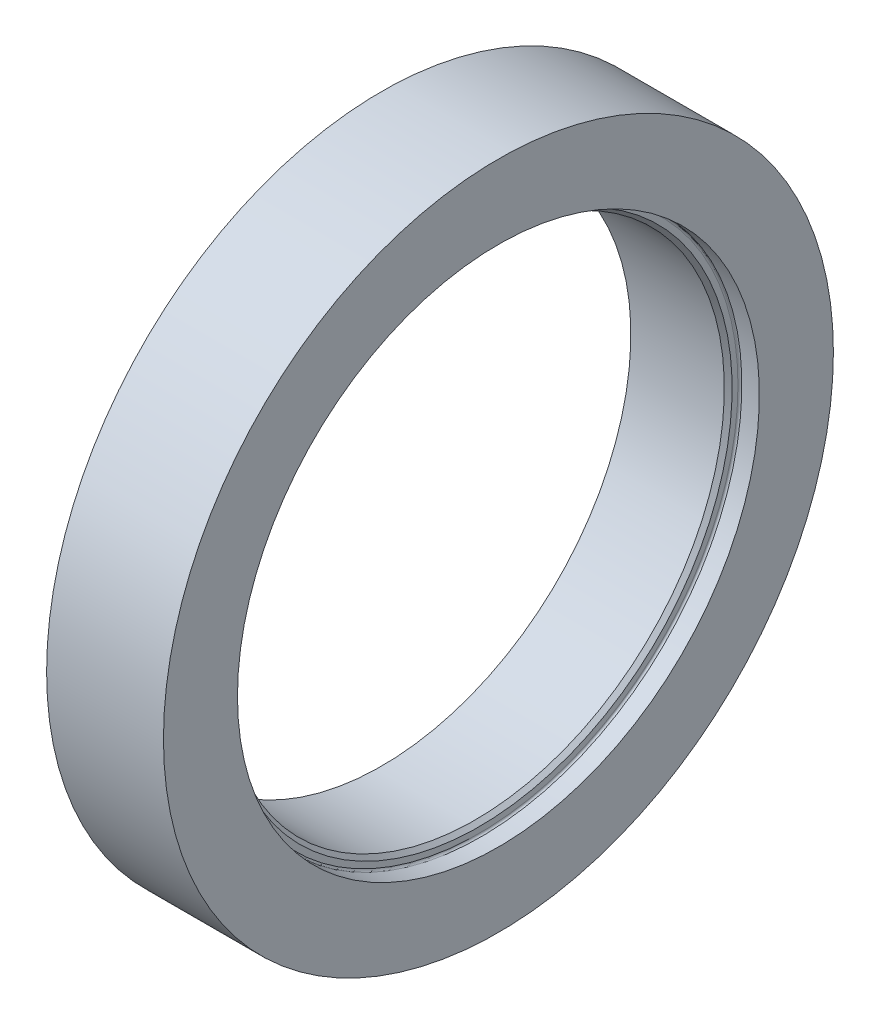
ISO-10303-21;
HEADER;
FILE_DESCRIPTION(('STEP AP214'),'2;1');
FILE_NAME('part.step','',(''),(''),'','','');
FILE_SCHEMA(('AUTOMOTIVE_DESIGN { 1 0 10303 214 1 1 1 1 }'));
ENDSEC;
DATA;
#1=APPLICATION_CONTEXT('core data for automotive mechanical design processes');
#2=APPLICATION_PROTOCOL_DEFINITION('international standard','automotive_design',2000,#1);
#3=PRODUCT_CONTEXT('',#1,'mechanical');
#4=PRODUCT('Part','Part','',(#3));
#5=PRODUCT_RELATED_PRODUCT_CATEGORY('part','',(#4));
#6=PRODUCT_DEFINITION_FORMATION('','',#4);
#7=PRODUCT_DEFINITION_CONTEXT('part definition',#1,'design');
#8=PRODUCT_DEFINITION('design','',#6,#7);
#9=PRODUCT_DEFINITION_SHAPE('','',#8);
#10=(LENGTH_UNIT() NAMED_UNIT(*) SI_UNIT(.MILLI.,.METRE.));
#11=(NAMED_UNIT(*) PLANE_ANGLE_UNIT() SI_UNIT($,.RADIAN.));
#12=(NAMED_UNIT(*) SI_UNIT($,.STERADIAN.) SOLID_ANGLE_UNIT());
#13=UNCERTAINTY_MEASURE_WITH_UNIT(LENGTH_MEASURE(1.E-05),#10,'distance_accuracy_value','');
#14=(GEOMETRIC_REPRESENTATION_CONTEXT(3) GLOBAL_UNCERTAINTY_ASSIGNED_CONTEXT((#13)) GLOBAL_UNIT_ASSIGNED_CONTEXT((#10,
#11,#12)) REPRESENTATION_CONTEXT('',''));
#15=CARTESIAN_POINT('',(0.,0.,0.));
#16=DIRECTION('',(0.,0.,1.));
#17=DIRECTION('',(1.,0.,0.));
#18=AXIS2_PLACEMENT_3D('',#15,#16,#17);
#19=CARTESIAN_POINT('',(0.,0.,0.));
#20=DIRECTION('',(-1.,0.,0.));
#21=DIRECTION('',(0.,0.,1.));
#22=AXIS2_PLACEMENT_3D('',#19,#20,#21);
#23=CYLINDRICAL_SURFACE('',#22,64.);
#24=CARTESIAN_POINT('',(24.,0.,0.));
#25=DIRECTION('',(-1.,0.,0.));
#26=DIRECTION('',(0.,0.,1.));
#27=AXIS2_PLACEMENT_3D('',#24,#25,#26);
#28=CIRCLE('',#27,64.);
#29=CARTESIAN_POINT('',(24.,0.,64.));
#30=VERTEX_POINT('',#29);
#31=EDGE_CURVE('E10',#30,#30,#28,.T.);
#32=ORIENTED_EDGE('',*,*,#31,.F.);
#33=EDGE_LOOP('',(#32));
#34=FACE_BOUND('',#33,.T.);
#35=CARTESIAN_POINT('',(0.,0.,0.));
#36=DIRECTION('',(-1.,0.,0.));
#37=DIRECTION('',(0.,0.,1.));
#38=AXIS2_PLACEMENT_3D('',#35,#36,#37);
#39=CIRCLE('',#38,64.);
#40=CARTESIAN_POINT('',(0.,0.,64.));
#41=VERTEX_POINT('',#40);
#42=EDGE_CURVE('E62',#41,#41,#39,.T.);
#43=ORIENTED_EDGE('',*,*,#42,.T.);
#44=EDGE_LOOP('',(#43));
#45=FACE_BOUND('',#44,.T.);
#46=ADVANCED_FACE('F34',(#34,#45),#23,.F.);
#47=CARTESIAN_POINT('',(24.,0.,0.));
#48=DIRECTION('',(1.,0.,0.));
#49=DIRECTION('',(0.,0.,-1.));
#50=AXIS2_PLACEMENT_3D('',#47,#48,#49);
#51=CONICAL_SURFACE('',#50,64.,0.785398163397448);
#52=CARTESIAN_POINT('',(25.,0.,0.));
#53=DIRECTION('',(-1.,0.,0.));
#54=DIRECTION('',(0.,0.,1.));
#55=AXIS2_PLACEMENT_3D('',#52,#53,#54);
#56=CIRCLE('',#55,65.);
#57=CARTESIAN_POINT('',(25.,0.,65.));
#58=VERTEX_POINT('',#57);
#59=EDGE_CURVE('E40',#58,#58,#56,.T.);
#60=ORIENTED_EDGE('',*,*,#59,.F.);
#61=EDGE_LOOP('',(#60));
#62=FACE_BOUND('',#61,.T.);
#63=ORIENTED_EDGE('',*,*,#31,.T.);
#64=EDGE_LOOP('',(#63));
#65=FACE_BOUND('',#64,.T.);
#66=ADVANCED_FACE('F99',(#62,#65),#51,.F.);
#67=CARTESIAN_POINT('',(25.,66.5,0.));
#68=DIRECTION('',(-1.,0.,0.));
#69=DIRECTION('',(0.,0.,1.));
#70=AXIS2_PLACEMENT_3D('',#67,#68,#69);
#71=PLANE('',#70);
#72=CARTESIAN_POINT('',(25.,0.,0.));
#73=DIRECTION('',(-1.,0.,0.));
#74=DIRECTION('',(0.,0.,1.));
#75=AXIS2_PLACEMENT_3D('',#72,#73,#74);
#76=CIRCLE('',#75,66.5);
#77=CARTESIAN_POINT('',(25.,0.,66.5));
#78=VERTEX_POINT('',#77);
#79=EDGE_CURVE('E44',#78,#78,#76,.T.);
#80=ORIENTED_EDGE('',*,*,#79,.F.);
#81=EDGE_LOOP('',(#80));
#82=FACE_BOUND('',#81,.T.);
#83=ORIENTED_EDGE('',*,*,#59,.T.);
#84=EDGE_LOOP('',(#83));
#85=FACE_BOUND('',#84,.T.);
#86=ADVANCED_FACE('F94',(#82,#85),#71,.F.);
#87=CARTESIAN_POINT('',(25.5,0.,0.));
#88=DIRECTION('',(-1.,0.,0.));
#89=DIRECTION('',(0.,0.,1.));
#90=AXIS2_PLACEMENT_3D('',#87,#88,#89);
#91=TOROIDAL_SURFACE('',#90,66.5,0.5);
#92=CARTESIAN_POINT('',(25.5,0.,0.));
#93=DIRECTION('',(-1.,0.,0.));
#94=DIRECTION('',(0.,0.,1.));
#95=AXIS2_PLACEMENT_3D('',#92,#93,#94);
#96=CIRCLE('',#95,67.);
#97=CARTESIAN_POINT('',(25.5,0.,67.));
#98=VERTEX_POINT('',#97);
#99=EDGE_CURVE('E48',#98,#98,#96,.T.);
#100=ORIENTED_EDGE('',*,*,#99,.F.);
#101=EDGE_LOOP('',(#100));
#102=FACE_BOUND('',#101,.T.);
#103=ORIENTED_EDGE('',*,*,#79,.T.);
#104=EDGE_LOOP('',(#103));
#105=FACE_BOUND('',#104,.T.);
#106=ADVANCED_FACE('F88',(#102,#105),#91,.F.);
#107=CARTESIAN_POINT('',(0.,0.,0.));
#108=DIRECTION('',(-1.,0.,0.));
#109=DIRECTION('',(0.,0.,1.));
#110=AXIS2_PLACEMENT_3D('',#107,#108,#109);
#111=CYLINDRICAL_SURFACE('',#110,67.);
#112=CARTESIAN_POINT('',(30.,0.,0.));
#113=DIRECTION('',(-1.,0.,0.));
#114=DIRECTION('',(0.,0.,1.));
#115=AXIS2_PLACEMENT_3D('',#112,#113,#114);
#116=CIRCLE('',#115,67.);
#117=CARTESIAN_POINT('',(30.,0.,67.));
#118=VERTEX_POINT('',#117);
#119=EDGE_CURVE('E53',#118,#118,#116,.T.);
#120=ORIENTED_EDGE('',*,*,#119,.F.);
#121=EDGE_LOOP('',(#120));
#122=FACE_BOUND('',#121,.T.);
#123=ORIENTED_EDGE('',*,*,#99,.T.);
#124=EDGE_LOOP('',(#123));
#125=FACE_BOUND('',#124,.T.);
#126=ADVANCED_FACE('F82',(#122,#125),#111,.F.);
#127=CARTESIAN_POINT('',(30.,86.,0.));
#128=DIRECTION('',(-1.,0.,0.));
#129=DIRECTION('',(0.,0.,1.));
#130=AXIS2_PLACEMENT_3D('',#127,#128,#129);
#131=PLANE('',#130);
#132=CARTESIAN_POINT('',(30.,0.,0.));
#133=DIRECTION('',(-1.,0.,0.));
#134=DIRECTION('',(0.,0.,1.));
#135=AXIS2_PLACEMENT_3D('',#132,#133,#134);
#136=CIRCLE('',#135,86.);
#137=CARTESIAN_POINT('',(30.,0.,86.));
#138=VERTEX_POINT('',#137);
#139=EDGE_CURVE('E56',#138,#138,#136,.T.);
#140=ORIENTED_EDGE('',*,*,#139,.F.);
#141=EDGE_LOOP('',(#140));
#142=FACE_BOUND('',#141,.T.);
#143=ORIENTED_EDGE('',*,*,#119,.T.);
#144=EDGE_LOOP('',(#143));
#145=FACE_BOUND('',#144,.T.);
#146=ADVANCED_FACE('F76',(#142,#145),#131,.F.);
#147=CARTESIAN_POINT('',(0.,0.,0.));
#148=DIRECTION('',(-1.,0.,0.));
#149=DIRECTION('',(0.,0.,1.));
#150=AXIS2_PLACEMENT_3D('',#147,#148,#149);
#151=CYLINDRICAL_SURFACE('',#150,86.);
#152=CARTESIAN_POINT('',(0.,0.,0.));
#153=DIRECTION('',(-1.,0.,0.));
#154=DIRECTION('',(0.,0.,1.));
#155=AXIS2_PLACEMENT_3D('',#152,#153,#154);
#156=CIRCLE('',#155,86.);
#157=CARTESIAN_POINT('',(0.,0.,86.));
#158=VERTEX_POINT('',#157);
#159=EDGE_CURVE('E59',#158,#158,#156,.T.);
#160=ORIENTED_EDGE('',*,*,#159,.F.);
#161=EDGE_LOOP('',(#160));
#162=FACE_BOUND('',#161,.T.);
#163=ORIENTED_EDGE('',*,*,#139,.T.);
#164=EDGE_LOOP('',(#163));
#165=FACE_BOUND('',#164,.T.);
#166=ADVANCED_FACE('F70',(#162,#165),#151,.T.);
#167=CARTESIAN_POINT('',(0.,64.,0.));
#168=DIRECTION('',(1.,0.,0.));
#169=DIRECTION('',(0.,0.,-1.));
#170=AXIS2_PLACEMENT_3D('',#167,#168,#169);
#171=PLANE('',#170);
#172=ORIENTED_EDGE('',*,*,#42,.F.);
#173=EDGE_LOOP('',(#172));
#174=FACE_BOUND('',#173,.T.);
#175=ORIENTED_EDGE('',*,*,#159,.T.);
#176=EDGE_LOOP('',(#175));
#177=FACE_BOUND('',#176,.T.);
#178=ADVANCED_FACE('F67',(#174,#177),#171,.F.);
#179=CLOSED_SHELL('',(#46,#66,#86,#106,#126,#146,#166,#178));
#180=MANIFOLD_SOLID_BREP('B2',#179);
#181=ADVANCED_BREP_SHAPE_REPRESENTATION('',(#18,#180),#14);
#182=SHAPE_DEFINITION_REPRESENTATION(#9,#181);
ENDSEC;
END-ISO-10303-21;
